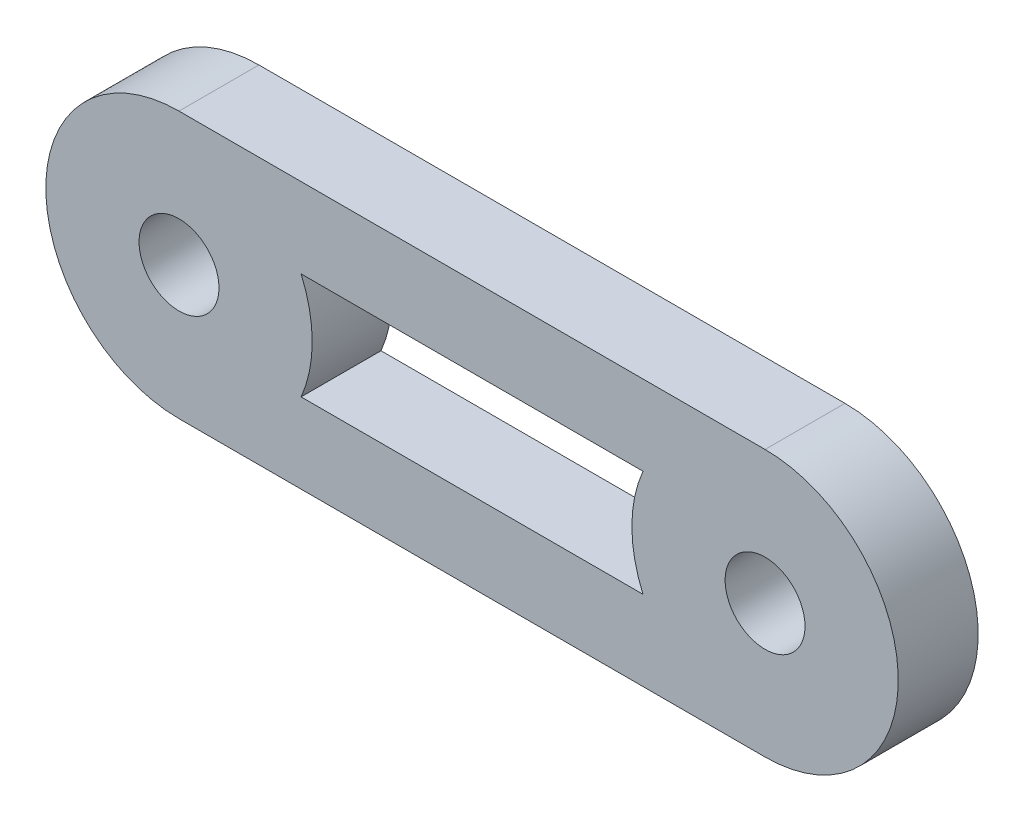
ISO-10303-21;
HEADER;
FILE_DESCRIPTION(('STEP AP214'),'2;1');
FILE_NAME('part.step','',(''),(''),'','','');
FILE_SCHEMA(('AUTOMOTIVE_DESIGN { 1 0 10303 214 1 1 1 1 }'));
ENDSEC;
DATA;
#1=APPLICATION_CONTEXT('core data for automotive mechanical design processes');
#2=APPLICATION_PROTOCOL_DEFINITION('international standard','automotive_design',2000,#1);
#3=PRODUCT_CONTEXT('',#1,'mechanical');
#4=PRODUCT('Part','Part','',(#3));
#5=PRODUCT_RELATED_PRODUCT_CATEGORY('part','',(#4));
#6=PRODUCT_DEFINITION_FORMATION('','',#4);
#7=PRODUCT_DEFINITION_CONTEXT('part definition',#1,'design');
#8=PRODUCT_DEFINITION('design','',#6,#7);
#9=PRODUCT_DEFINITION_SHAPE('','',#8);
#10=(LENGTH_UNIT() NAMED_UNIT(*) SI_UNIT(.MILLI.,.METRE.));
#11=(NAMED_UNIT(*) PLANE_ANGLE_UNIT() SI_UNIT($,.RADIAN.));
#12=(NAMED_UNIT(*) SI_UNIT($,.STERADIAN.) SOLID_ANGLE_UNIT());
#13=UNCERTAINTY_MEASURE_WITH_UNIT(LENGTH_MEASURE(1.E-05),#10,'distance_accuracy_value','');
#14=(GEOMETRIC_REPRESENTATION_CONTEXT(3) GLOBAL_UNCERTAINTY_ASSIGNED_CONTEXT((#13)) GLOBAL_UNIT_ASSIGNED_CONTEXT((#10,
#11,#12)) REPRESENTATION_CONTEXT('',''));
#15=CARTESIAN_POINT('',(0.,0.,0.));
#16=DIRECTION('',(0.,0.,1.));
#17=DIRECTION('',(1.,0.,0.));
#18=AXIS2_PLACEMENT_3D('',#15,#16,#17);
#19=CARTESIAN_POINT('',(11.,-5.,-3.));
#20=DIRECTION('',(0.,1.,0.));
#21=DIRECTION('',(0.,0.,-1.));
#22=AXIS2_PLACEMENT_3D('',#19,#20,#21);
#23=PLANE('',#22);
#24=DIRECTION('',(1.,0.,0.));
#25=VECTOR('',#24,1.);
#26=CARTESIAN_POINT('',(11.,-5.,0.));
#27=LINE('',#26,#25);
#28=CARTESIAN_POINT('',(0.,-5.,0.));
#29=VERTEX_POINT('',#28);
#30=CARTESIAN_POINT('',(22.,-5.,0.));
#31=VERTEX_POINT('',#30);
#32=EDGE_CURVE('E150',#29,#31,#27,.T.);
#33=ORIENTED_EDGE('',*,*,#32,.F.);
#34=DIRECTION('',(0.,0.,1.));
#35=VECTOR('',#34,1.);
#36=CARTESIAN_POINT('',(0.,-5.,-3.));
#37=LINE('',#36,#35);
#38=CARTESIAN_POINT('',(0.,-5.,-3.));
#39=VERTEX_POINT('',#38);
#40=EDGE_CURVE('E144',#39,#29,#37,.T.);
#41=ORIENTED_EDGE('',*,*,#40,.F.);
#42=DIRECTION('',(1.,0.,0.));
#43=VECTOR('',#42,1.);
#44=CARTESIAN_POINT('',(11.,-5.,-3.));
#45=LINE('',#44,#43);
#46=CARTESIAN_POINT('',(22.,-5.,-3.));
#47=VERTEX_POINT('',#46);
#48=EDGE_CURVE('E134',#39,#47,#45,.T.);
#49=ORIENTED_EDGE('',*,*,#48,.T.);
#50=DIRECTION('',(0.,0.,1.));
#51=VECTOR('',#50,1.);
#52=CARTESIAN_POINT('',(22.,-5.,-3.));
#53=LINE('',#52,#51);
#54=EDGE_CURVE('E167',#47,#31,#53,.T.);
#55=ORIENTED_EDGE('',*,*,#54,.T.);
#56=EDGE_LOOP('',(#33,#41,#49,#55));
#57=FACE_BOUND('',#56,.T.);
#58=ADVANCED_FACE('F34',(#57),#23,.F.);
#59=CARTESIAN_POINT('',(22.,0.,-3.));
#60=DIRECTION('',(0.,0.,1.));
#61=DIRECTION('',(-1.,0.,0.));
#62=AXIS2_PLACEMENT_3D('',#59,#60,#61);
#63=CYLINDRICAL_SURFACE('',#62,5.);
#64=CARTESIAN_POINT('',(22.,0.,0.));
#65=DIRECTION('',(0.,0.,1.));
#66=DIRECTION('',(1.,0.,0.));
#67=AXIS2_PLACEMENT_3D('',#64,#65,#66);
#68=CIRCLE('',#67,5.);
#69=CARTESIAN_POINT('',(22.,5.,0.));
#70=VERTEX_POINT('',#69);
#71=EDGE_CURVE('E153',#31,#70,#68,.T.);
#72=ORIENTED_EDGE('',*,*,#71,.F.);
#73=ORIENTED_EDGE('',*,*,#54,.F.);
#74=CARTESIAN_POINT('',(22.,0.,-3.));
#75=DIRECTION('',(0.,0.,1.));
#76=DIRECTION('',(1.,0.,0.));
#77=AXIS2_PLACEMENT_3D('',#74,#75,#76);
#78=CIRCLE('',#77,5.);
#79=CARTESIAN_POINT('',(22.,5.,-3.));
#80=VERTEX_POINT('',#79);
#81=EDGE_CURVE('E137',#47,#80,#78,.T.);
#82=ORIENTED_EDGE('',*,*,#81,.T.);
#83=DIRECTION('',(0.,0.,1.));
#84=VECTOR('',#83,1.);
#85=CARTESIAN_POINT('',(22.,5.,-3.));
#86=LINE('',#85,#84);
#87=EDGE_CURVE('E164',#80,#70,#86,.T.);
#88=ORIENTED_EDGE('',*,*,#87,.T.);
#89=EDGE_LOOP('',(#72,#73,#82,#88));
#90=FACE_BOUND('',#89,.T.);
#91=ADVANCED_FACE('F192',(#90),#63,.T.);
#92=CARTESIAN_POINT('',(11.,5.,-3.));
#93=DIRECTION('',(0.,1.,0.));
#94=DIRECTION('',(0.,0.,-1.));
#95=AXIS2_PLACEMENT_3D('',#92,#93,#94);
#96=PLANE('',#95);
#97=DIRECTION('',(1.,0.,0.));
#98=VECTOR('',#97,1.);
#99=CARTESIAN_POINT('',(11.,5.,0.));
#100=LINE('',#99,#98);
#101=CARTESIAN_POINT('',(0.,5.,0.));
#102=VERTEX_POINT('',#101);
#103=EDGE_CURVE('E156',#102,#70,#100,.T.);
#104=ORIENTED_EDGE('',*,*,#103,.T.);
#105=ORIENTED_EDGE('',*,*,#87,.F.);
#106=DIRECTION('',(1.,0.,0.));
#107=VECTOR('',#106,1.);
#108=CARTESIAN_POINT('',(11.,5.,-3.));
#109=LINE('',#108,#107);
#110=CARTESIAN_POINT('',(0.,5.,-3.));
#111=VERTEX_POINT('',#110);
#112=EDGE_CURVE('E140',#111,#80,#109,.T.);
#113=ORIENTED_EDGE('',*,*,#112,.F.);
#114=DIRECTION('',(0.,0.,1.));
#115=VECTOR('',#114,1.);
#116=CARTESIAN_POINT('',(0.,5.,-3.));
#117=LINE('',#116,#115);
#118=EDGE_CURVE('E161',#111,#102,#117,.T.);
#119=ORIENTED_EDGE('',*,*,#118,.T.);
#120=EDGE_LOOP('',(#104,#105,#113,#119));
#121=FACE_BOUND('',#120,.T.);
#122=ADVANCED_FACE('F198',(#121),#96,.T.);
#123=CARTESIAN_POINT('',(0.,0.,-3.));
#124=DIRECTION('',(0.,0.,1.));
#125=DIRECTION('',(-1.,0.,0.));
#126=AXIS2_PLACEMENT_3D('',#123,#124,#125);
#127=CYLINDRICAL_SURFACE('',#126,1.5);
#128=CARTESIAN_POINT('',(0.,0.,-3.));
#129=DIRECTION('',(0.,0.,1.));
#130=DIRECTION('',(1.,0.,0.));
#131=AXIS2_PLACEMENT_3D('',#128,#129,#130);
#132=CIRCLE('',#131,1.5);
#133=CARTESIAN_POINT('',(1.5,0.,-3.));
#134=VERTEX_POINT('',#133);
#135=EDGE_CURVE('E130',#134,#134,#132,.T.);
#136=ORIENTED_EDGE('',*,*,#135,.F.);
#137=EDGE_LOOP('',(#136));
#138=FACE_BOUND('',#137,.T.);
#139=CARTESIAN_POINT('',(0.,0.,0.));
#140=DIRECTION('',(0.,0.,1.));
#141=DIRECTION('',(1.,0.,0.));
#142=AXIS2_PLACEMENT_3D('',#139,#140,#141);
#143=CIRCLE('',#142,1.5);
#144=CARTESIAN_POINT('',(1.5,0.,0.));
#145=VERTEX_POINT('',#144);
#146=EDGE_CURVE('E147',#145,#145,#143,.T.);
#147=ORIENTED_EDGE('',*,*,#146,.T.);
#148=EDGE_LOOP('',(#147));
#149=FACE_BOUND('',#148,.T.);
#150=ADVANCED_FACE('F203',(#138,#149),#127,.F.);
#151=CARTESIAN_POINT('',(22.,0.,-3.));
#152=DIRECTION('',(0.,0.,1.));
#153=DIRECTION('',(-1.,0.,0.));
#154=AXIS2_PLACEMENT_3D('',#151,#152,#153);
#155=CYLINDRICAL_SURFACE('',#154,1.5);
#156=CARTESIAN_POINT('',(22.,0.,-3.));
#157=DIRECTION('',(0.,0.,1.));
#158=DIRECTION('',(1.,0.,0.));
#159=AXIS2_PLACEMENT_3D('',#156,#157,#158);
#160=CIRCLE('',#159,1.5);
#161=CARTESIAN_POINT('',(23.5,0.,-3.));
#162=VERTEX_POINT('',#161);
#163=EDGE_CURVE('E127',#162,#162,#160,.T.);
#164=ORIENTED_EDGE('',*,*,#163,.F.);
#165=EDGE_LOOP('',(#164));
#166=FACE_BOUND('',#165,.T.);
#167=CARTESIAN_POINT('',(22.,0.,0.));
#168=DIRECTION('',(0.,0.,1.));
#169=DIRECTION('',(1.,0.,0.));
#170=AXIS2_PLACEMENT_3D('',#167,#168,#169);
#171=CIRCLE('',#170,1.5);
#172=CARTESIAN_POINT('',(23.5,0.,0.));
#173=VERTEX_POINT('',#172);
#174=EDGE_CURVE('E124',#173,#173,#171,.T.);
#175=ORIENTED_EDGE('',*,*,#174,.T.);
#176=EDGE_LOOP('',(#175));
#177=FACE_BOUND('',#176,.T.);
#178=ADVANCED_FACE('F36',(#166,#177),#155,.F.);
#179=CARTESIAN_POINT('',(0.,0.,-3.));
#180=DIRECTION('',(0.,0.,1.));
#181=DIRECTION('',(-1.,0.,0.));
#182=AXIS2_PLACEMENT_3D('',#179,#180,#181);
#183=CYLINDRICAL_SURFACE('',#182,5.);
#184=CARTESIAN_POINT('',(0.,0.,0.));
#185=DIRECTION('',(0.,0.,1.));
#186=DIRECTION('',(1.,0.,0.));
#187=AXIS2_PLACEMENT_3D('',#184,#185,#186);
#188=CIRCLE('',#187,5.);
#189=EDGE_CURVE('E131',#29,#102,#188,.F.);
#190=ORIENTED_EDGE('',*,*,#189,.T.);
#191=ORIENTED_EDGE('',*,*,#118,.F.);
#192=CARTESIAN_POINT('',(0.,0.,-3.));
#193=DIRECTION('',(0.,0.,1.));
#194=DIRECTION('',(1.,0.,0.));
#195=AXIS2_PLACEMENT_3D('',#192,#193,#194);
#196=CIRCLE('',#195,5.);
#197=EDGE_CURVE('E142',#39,#111,#196,.F.);
#198=ORIENTED_EDGE('',*,*,#197,.F.);
#199=ORIENTED_EDGE('',*,*,#40,.T.);
#200=EDGE_LOOP('',(#190,#191,#198,#199));
#201=FACE_BOUND('',#200,.T.);
#202=ADVANCED_FACE('F210',(#201),#183,.T.);
#203=CARTESIAN_POINT('',(11.,-26.2186144567226,-3.));
#204=DIRECTION('',(0.,0.,-1.));
#205=DIRECTION('',(1.,0.,0.));
#206=AXIS2_PLACEMENT_3D('',#203,#204,#205);
#207=PLANE('',#206);
#208=CARTESIAN_POINT('',(22.,0.,-3.));
#209=DIRECTION('',(0.,0.,-1.));
#210=DIRECTION('',(1.,0.,0.));
#211=AXIS2_PLACEMENT_3D('',#208,#209,#210);
#212=CIRCLE('',#211,5.);
#213=CARTESIAN_POINT('',(17.4174243050442,-2.,-3.));
#214=VERTEX_POINT('',#213);
#215=CARTESIAN_POINT('',(17.4174243050442,2.,-3.));
#216=VERTEX_POINT('',#215);
#217=EDGE_CURVE('E117',#214,#216,#212,.T.);
#218=ORIENTED_EDGE('',*,*,#217,.T.);
#219=DIRECTION('',(-1.,0.,0.));
#220=VECTOR('',#219,1.);
#221=CARTESIAN_POINT('',(17.4174243050442,2.,-3.));
#222=LINE('',#221,#220);
#223=CARTESIAN_POINT('',(4.58257569495584,2.,-3.));
#224=VERTEX_POINT('',#223);
#225=EDGE_CURVE('E100',#216,#224,#222,.T.);
#226=ORIENTED_EDGE('',*,*,#225,.T.);
#227=CARTESIAN_POINT('',(0.,0.,-3.));
#228=DIRECTION('',(0.,0.,-1.));
#229=DIRECTION('',(1.,0.,0.));
#230=AXIS2_PLACEMENT_3D('',#227,#228,#229);
#231=CIRCLE('',#230,5.);
#232=CARTESIAN_POINT('',(4.58257569495584,-2.,-3.));
#233=VERTEX_POINT('',#232);
#234=EDGE_CURVE('E108',#224,#233,#231,.T.);
#235=ORIENTED_EDGE('',*,*,#234,.T.);
#236=DIRECTION('',(1.,0.,0.));
#237=VECTOR('',#236,1.);
#238=CARTESIAN_POINT('',(4.58257569495584,-2.,-3.));
#239=LINE('',#238,#237);
#240=EDGE_CURVE('E113',#233,#214,#239,.T.);
#241=ORIENTED_EDGE('',*,*,#240,.T.);
#242=EDGE_LOOP('',(#218,#226,#235,#241));
#243=FACE_BOUND('',#242,.T.);
#244=ORIENTED_EDGE('',*,*,#163,.T.);
#245=EDGE_LOOP('',(#244));
#246=FACE_BOUND('',#245,.T.);
#247=ORIENTED_EDGE('',*,*,#135,.T.);
#248=EDGE_LOOP('',(#247));
#249=FACE_BOUND('',#248,.T.);
#250=ORIENTED_EDGE('',*,*,#48,.F.);
#251=ORIENTED_EDGE('',*,*,#197,.T.);
#252=ORIENTED_EDGE('',*,*,#112,.T.);
#253=ORIENTED_EDGE('',*,*,#81,.F.);
#254=EDGE_LOOP('',(#250,#251,#252,#253));
#255=FACE_BOUND('',#254,.T.);
#256=ADVANCED_FACE('F115',(#243,#246,#249,#255),#207,.T.);
#257=CARTESIAN_POINT('',(11.,-26.2186144567226,0.));
#258=DIRECTION('',(0.,0.,-1.));
#259=DIRECTION('',(1.,0.,0.));
#260=AXIS2_PLACEMENT_3D('',#257,#258,#259);
#261=PLANE('',#260);
#262=DIRECTION('',(1.,0.,0.));
#263=VECTOR('',#262,1.);
#264=CARTESIAN_POINT('',(11.,-2.,0.));
#265=LINE('',#264,#263);
#266=CARTESIAN_POINT('',(4.58257569495584,-2.,0.));
#267=VERTEX_POINT('',#266);
#268=CARTESIAN_POINT('',(17.4174243050442,-2.,0.));
#269=VERTEX_POINT('',#268);
#270=EDGE_CURVE('E42',#267,#269,#265,.T.);
#271=ORIENTED_EDGE('',*,*,#270,.F.);
#272=CARTESIAN_POINT('',(0.,0.,0.));
#273=DIRECTION('',(0.,0.,1.));
#274=DIRECTION('',(1.,0.,0.));
#275=AXIS2_PLACEMENT_3D('',#272,#273,#274);
#276=CIRCLE('',#275,5.);
#277=CARTESIAN_POINT('',(4.58257569495584,2.,0.));
#278=VERTEX_POINT('',#277);
#279=EDGE_CURVE('E171',#278,#267,#276,.F.);
#280=ORIENTED_EDGE('',*,*,#279,.F.);
#281=DIRECTION('',(-1.,0.,0.));
#282=VECTOR('',#281,1.);
#283=CARTESIAN_POINT('',(11.,2.,0.));
#284=LINE('',#283,#282);
#285=CARTESIAN_POINT('',(17.4174243050442,2.,0.));
#286=VERTEX_POINT('',#285);
#287=EDGE_CURVE('E103',#286,#278,#284,.T.);
#288=ORIENTED_EDGE('',*,*,#287,.F.);
#289=CARTESIAN_POINT('',(22.,0.,0.));
#290=DIRECTION('',(0.,0.,1.));
#291=DIRECTION('',(1.,0.,0.));
#292=AXIS2_PLACEMENT_3D('',#289,#290,#291);
#293=CIRCLE('',#292,5.);
#294=EDGE_CURVE('E11',#269,#286,#293,.F.);
#295=ORIENTED_EDGE('',*,*,#294,.F.);
#296=EDGE_LOOP('',(#271,#280,#288,#295));
#297=FACE_BOUND('',#296,.T.);
#298=ORIENTED_EDGE('',*,*,#174,.F.);
#299=EDGE_LOOP('',(#298));
#300=FACE_BOUND('',#299,.T.);
#301=ORIENTED_EDGE('',*,*,#146,.F.);
#302=EDGE_LOOP('',(#301));
#303=FACE_BOUND('',#302,.T.);
#304=ORIENTED_EDGE('',*,*,#32,.T.);
#305=ORIENTED_EDGE('',*,*,#71,.T.);
#306=ORIENTED_EDGE('',*,*,#103,.F.);
#307=ORIENTED_EDGE('',*,*,#189,.F.);
#308=EDGE_LOOP('',(#304,#305,#306,#307));
#309=FACE_BOUND('',#308,.T.);
#310=ADVANCED_FACE('F178',(#297,#300,#303,#309),#261,.F.);
#311=CARTESIAN_POINT('',(22.,0.,7.));
#312=DIRECTION('',(0.,0.,-1.));
#313=DIRECTION('',(1.,0.,0.));
#314=AXIS2_PLACEMENT_3D('',#311,#312,#313);
#315=CYLINDRICAL_SURFACE('',#314,5.);
#316=DIRECTION('',(0.,0.,-1.));
#317=VECTOR('',#316,1.);
#318=CARTESIAN_POINT('',(17.4174243050442,-2.,7.));
#319=LINE('',#318,#317);
#320=EDGE_CURVE('E122',#269,#214,#319,.T.);
#321=ORIENTED_EDGE('',*,*,#320,.F.);
#322=ORIENTED_EDGE('',*,*,#294,.T.);
#323=DIRECTION('',(0.,0.,-1.));
#324=VECTOR('',#323,1.);
#325=CARTESIAN_POINT('',(17.4174243050442,2.,7.));
#326=LINE('',#325,#324);
#327=EDGE_CURVE('E48',#286,#216,#326,.T.);
#328=ORIENTED_EDGE('',*,*,#327,.T.);
#329=ORIENTED_EDGE('',*,*,#217,.F.);
#330=EDGE_LOOP('',(#321,#322,#328,#329));
#331=FACE_BOUND('',#330,.T.);
#332=ADVANCED_FACE('F180',(#331),#315,.T.);
#333=CARTESIAN_POINT('',(4.58257569495584,-2.,7.));
#334=DIRECTION('',(0.,-1.,0.));
#335=DIRECTION('',(0.,0.,1.));
#336=AXIS2_PLACEMENT_3D('',#333,#334,#335);
#337=PLANE('',#336);
#338=DIRECTION('',(0.,0.,-1.));
#339=VECTOR('',#338,1.);
#340=CARTESIAN_POINT('',(4.58257569495584,-2.,7.));
#341=LINE('',#340,#339);
#342=EDGE_CURVE('E105',#267,#233,#341,.T.);
#343=ORIENTED_EDGE('',*,*,#342,.F.);
#344=ORIENTED_EDGE('',*,*,#270,.T.);
#345=ORIENTED_EDGE('',*,*,#320,.T.);
#346=ORIENTED_EDGE('',*,*,#240,.F.);
#347=EDGE_LOOP('',(#343,#344,#345,#346));
#348=FACE_BOUND('',#347,.T.);
#349=ADVANCED_FACE('F175',(#348),#337,.F.);
#350=CARTESIAN_POINT('',(0.,0.,7.));
#351=DIRECTION('',(0.,0.,-1.));
#352=DIRECTION('',(1.,0.,0.));
#353=AXIS2_PLACEMENT_3D('',#350,#351,#352);
#354=CYLINDRICAL_SURFACE('',#353,5.);
#355=DIRECTION('',(0.,0.,-1.));
#356=VECTOR('',#355,1.);
#357=CARTESIAN_POINT('',(4.58257569495584,2.,7.));
#358=LINE('',#357,#356);
#359=EDGE_CURVE('E56',#278,#224,#358,.T.);
#360=ORIENTED_EDGE('',*,*,#359,.F.);
#361=ORIENTED_EDGE('',*,*,#279,.T.);
#362=ORIENTED_EDGE('',*,*,#342,.T.);
#363=ORIENTED_EDGE('',*,*,#234,.F.);
#364=EDGE_LOOP('',(#360,#361,#362,#363));
#365=FACE_BOUND('',#364,.T.);
#366=ADVANCED_FACE('F109',(#365),#354,.T.);
#367=CARTESIAN_POINT('',(17.4174243050442,2.,7.));
#368=DIRECTION('',(0.,1.,0.));
#369=DIRECTION('',(0.,0.,-1.));
#370=AXIS2_PLACEMENT_3D('',#367,#368,#369);
#371=PLANE('',#370);
#372=ORIENTED_EDGE('',*,*,#327,.F.);
#373=ORIENTED_EDGE('',*,*,#287,.T.);
#374=ORIENTED_EDGE('',*,*,#359,.T.);
#375=ORIENTED_EDGE('',*,*,#225,.F.);
#376=EDGE_LOOP('',(#372,#373,#374,#375));
#377=FACE_BOUND('',#376,.T.);
#378=ADVANCED_FACE('F98',(#377),#371,.F.);
#379=CLOSED_SHELL('',(#58,#91,#122,#150,#178,#202,#256,#310,#332,#349,#366,#378));
#380=MANIFOLD_SOLID_BREP('B2',#379);
#381=ADVANCED_BREP_SHAPE_REPRESENTATION('',(#18,#380),#14);
#382=SHAPE_DEFINITION_REPRESENTATION(#9,#381);
ENDSEC;
END-ISO-10303-21;
